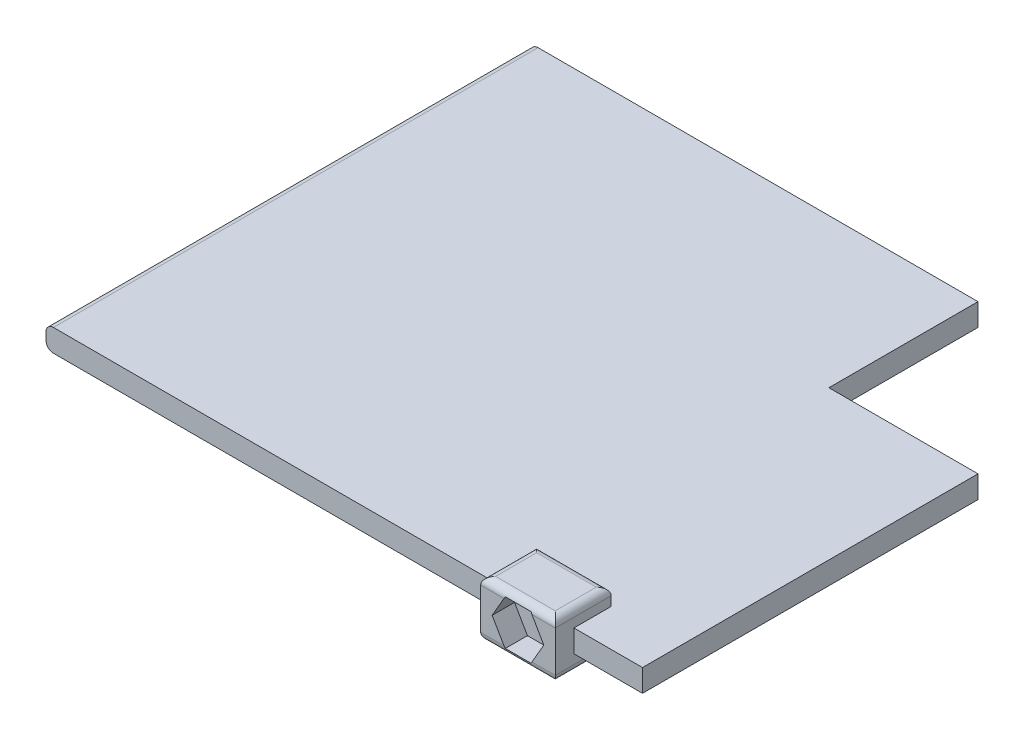
ISO-10303-21;
HEADER;
FILE_DESCRIPTION(('STEP AP214'),'2;1');
FILE_NAME('part.step','',(''),(''),'','','');
FILE_SCHEMA(('AUTOMOTIVE_DESIGN { 1 0 10303 214 1 1 1 1 }'));
ENDSEC;
DATA;
#1=APPLICATION_CONTEXT('core data for automotive mechanical design processes');
#2=APPLICATION_PROTOCOL_DEFINITION('international standard','automotive_design',2000,#1);
#3=PRODUCT_CONTEXT('',#1,'mechanical');
#4=PRODUCT('Part','Part','',(#3));
#5=PRODUCT_RELATED_PRODUCT_CATEGORY('part','',(#4));
#6=PRODUCT_DEFINITION_FORMATION('','',#4);
#7=PRODUCT_DEFINITION_CONTEXT('part definition',#1,'design');
#8=PRODUCT_DEFINITION('design','',#6,#7);
#9=PRODUCT_DEFINITION_SHAPE('','',#8);
#10=(LENGTH_UNIT() NAMED_UNIT(*) SI_UNIT(.MILLI.,.METRE.));
#11=(NAMED_UNIT(*) PLANE_ANGLE_UNIT() SI_UNIT($,.RADIAN.));
#12=(NAMED_UNIT(*) SI_UNIT($,.STERADIAN.) SOLID_ANGLE_UNIT());
#13=UNCERTAINTY_MEASURE_WITH_UNIT(LENGTH_MEASURE(1.E-05),#10,'distance_accuracy_value','');
#14=(GEOMETRIC_REPRESENTATION_CONTEXT(3) GLOBAL_UNCERTAINTY_ASSIGNED_CONTEXT((#13)) GLOBAL_UNIT_ASSIGNED_CONTEXT((#10,
#11,#12)) REPRESENTATION_CONTEXT('',''));
#15=CARTESIAN_POINT('',(0.,0.,0.));
#16=DIRECTION('',(0.,0.,1.));
#17=DIRECTION('',(1.,0.,0.));
#18=AXIS2_PLACEMENT_3D('',#15,#16,#17);
#19=CARTESIAN_POINT('',(0.,0.,70.));
#20=DIRECTION('',(0.,0.,-1.));
#21=DIRECTION('',(-1.,0.,0.));
#22=AXIS2_PLACEMENT_3D('',#19,#20,#21);
#23=PLANE('',#22);
#24=DIRECTION('',(0.,1.,0.));
#25=VECTOR('',#24,1.);
#26=CARTESIAN_POINT('',(61.6060586824194,-4.52178410155881,70.));
#27=LINE('',#26,#25);
#28=CARTESIAN_POINT('',(61.6060586824194,-2.52178410155881,70.));
#29=VERTEX_POINT('',#28);
#30=CARTESIAN_POINT('',(61.6060586824194,8.47821589844119,70.));
#31=VERTEX_POINT('',#30);
#32=EDGE_CURVE('E297',#29,#31,#27,.T.);
#33=ORIENTED_EDGE('',*,*,#32,.T.);
#34=DIRECTION('',(-1.,0.,0.));
#35=VECTOR('',#34,1.);
#36=CARTESIAN_POINT('',(0.,8.47821589844119,70.));
#37=LINE('',#36,#35);
#38=CARTESIAN_POINT('',(55.3573739641616,8.47821589844119,70.));
#39=VERTEX_POINT('',#38);
#40=EDGE_CURVE('E427',#31,#39,#37,.T.);
#41=ORIENTED_EDGE('',*,*,#40,.T.);
#42=DIRECTION('',(-0.500379729351067,0.865806055912381,0.));
#43=VECTOR('',#42,1.);
#44=CARTESIAN_POINT('',(58.5342612465209,2.98125411786546,70.));
#45=LINE('',#44,#43);
#46=CARTESIAN_POINT('',(58.5342612465209,2.98125411786546,70.));
#47=VERTEX_POINT('',#46);
#48=EDGE_CURVE('E275',#47,#39,#45,.T.);
#49=ORIENTED_EDGE('',*,*,#48,.F.);
#50=DIRECTION('',(0.499620174494999,0.866244585112996,0.));
#51=VECTOR('',#50,1.);
#52=CARTESIAN_POINT('',(55.0727911396738,-3.02026441492307,70.));
#53=LINE('',#52,#51);
#54=CARTESIAN_POINT('',(55.3602974922969,-2.52178410155881,70.));
#55=VERTEX_POINT('',#54);
#56=EDGE_CURVE('E273',#55,#47,#53,.T.);
#57=ORIENTED_EDGE('',*,*,#56,.F.);
#58=DIRECTION('',(1.,0.,0.));
#59=VECTOR('',#58,1.);
#60=CARTESIAN_POINT('',(0.,-2.52178410155881,70.));
#61=LINE('',#60,#59);
#62=EDGE_CURVE('E387',#55,#29,#61,.T.);
#63=ORIENTED_EDGE('',*,*,#62,.T.);
#64=EDGE_LOOP('',(#33,#41,#49,#57,#63));
#65=FACE_BOUND('',#64,.T.);
#66=ADVANCED_FACE('F44',(#65),#23,.F.);
#67=CARTESIAN_POINT('',(-80.,6.,65.));
#68=DIRECTION('',(0.,0.,-1.));
#69=DIRECTION('',(-1.,0.,0.));
#70=AXIS2_PLACEMENT_3D('',#67,#68,#69);
#71=PLANE('',#70);
#72=DIRECTION('',(0.,1.,0.));
#73=VECTOR('',#72,1.);
#74=CARTESIAN_POINT('',(61.6060586824194,6.,65.));
#75=LINE('',#74,#73);
#76=CARTESIAN_POINT('',(61.6060586824194,0.,65.));
#77=VERTEX_POINT('',#76);
#78=CARTESIAN_POINT('',(61.6060586824194,6.,65.));
#79=VERTEX_POINT('',#78);
#80=EDGE_CURVE('E313',#77,#79,#75,.T.);
#81=ORIENTED_EDGE('',*,*,#80,.F.);
#82=DIRECTION('',(1.,0.,0.));
#83=VECTOR('',#82,1.);
#84=CARTESIAN_POINT('',(-80.,0.,65.));
#85=LINE('',#84,#83);
#86=CARTESIAN_POINT('',(80.,0.,65.));
#87=VERTEX_POINT('',#86);
#88=EDGE_CURVE('E348',#77,#87,#85,.T.);
#89=ORIENTED_EDGE('',*,*,#88,.T.);
#90=DIRECTION('',(0.,-1.,0.));
#91=VECTOR('',#90,1.);
#92=CARTESIAN_POINT('',(80.,6.,65.));
#93=LINE('',#92,#91);
#94=CARTESIAN_POINT('',(80.,6.,65.));
#95=VERTEX_POINT('',#94);
#96=EDGE_CURVE('E342',#95,#87,#93,.T.);
#97=ORIENTED_EDGE('',*,*,#96,.F.);
#98=DIRECTION('',(1.,0.,0.));
#99=VECTOR('',#98,1.);
#100=CARTESIAN_POINT('',(-80.,6.,65.));
#101=LINE('',#100,#99);
#102=EDGE_CURVE('E339',#79,#95,#101,.T.);
#103=ORIENTED_EDGE('',*,*,#102,.F.);
#104=EDGE_LOOP('',(#81,#89,#97,#103));
#105=FACE_BOUND('',#104,.T.);
#106=ADVANCED_FACE('F482',(#105),#71,.F.);
#107=CARTESIAN_POINT('',(-78.,6.,65.));
#108=VERTEX_POINT('',#107);
#109=CARTESIAN_POINT('',(41.6060586824194,6.,65.));
#110=VERTEX_POINT('',#109);
#111=EDGE_CURVE('E340',#108,#110,#101,.T.);
#112=ORIENTED_EDGE('',*,*,#111,.F.);
#113=CARTESIAN_POINT('',(-78.,4.,65.));
#114=DIRECTION('',(0.,0.,-1.));
#115=DIRECTION('',(-1.,0.,0.));
#116=AXIS2_PLACEMENT_3D('',#113,#114,#115);
#117=CIRCLE('',#116,2.);
#118=CARTESIAN_POINT('',(-80.,4.,65.));
#119=VERTEX_POINT('',#118);
#120=EDGE_CURVE('E374',#108,#119,#117,.F.);
#121=ORIENTED_EDGE('',*,*,#120,.T.);
#122=DIRECTION('',(0.,-1.,0.));
#123=VECTOR('',#122,1.);
#124=CARTESIAN_POINT('',(-80.,6.,65.));
#125=LINE('',#124,#123);
#126=CARTESIAN_POINT('',(-80.,2.,65.));
#127=VERTEX_POINT('',#126);
#128=EDGE_CURVE('E352',#119,#127,#125,.T.);
#129=ORIENTED_EDGE('',*,*,#128,.T.);
#130=CARTESIAN_POINT('',(-78.,2.,65.));
#131=DIRECTION('',(0.,0.,-1.));
#132=DIRECTION('',(-1.,0.,0.));
#133=AXIS2_PLACEMENT_3D('',#130,#131,#132);
#134=CIRCLE('',#133,2.);
#135=CARTESIAN_POINT('',(-78.,0.,65.));
#136=VERTEX_POINT('',#135);
#137=EDGE_CURVE('E372',#127,#136,#134,.F.);
#138=ORIENTED_EDGE('',*,*,#137,.T.);
#139=CARTESIAN_POINT('',(41.6060586824194,0.,65.));
#140=VERTEX_POINT('',#139);
#141=EDGE_CURVE('E336',#136,#140,#85,.T.);
#142=ORIENTED_EDGE('',*,*,#141,.T.);
#143=DIRECTION('',(0.,-1.,0.));
#144=VECTOR('',#143,1.);
#145=CARTESIAN_POINT('',(41.6060586824194,6.,65.));
#146=LINE('',#145,#144);
#147=EDGE_CURVE('E307',#110,#140,#146,.T.);
#148=ORIENTED_EDGE('',*,*,#147,.F.);
#149=EDGE_LOOP('',(#112,#121,#129,#138,#142,#148));
#150=FACE_BOUND('',#149,.T.);
#151=ADVANCED_FACE('F491',(#150),#71,.F.);
#152=CARTESIAN_POINT('',(0.,6.,0.));
#153=DIRECTION('',(0.,-1.,0.));
#154=DIRECTION('',(0.,0.,-1.));
#155=AXIS2_PLACEMENT_3D('',#152,#153,#154);
#156=PLANE('',#155);
#157=DIRECTION('',(-1.,0.,0.));
#158=VECTOR('',#157,1.);
#159=CARTESIAN_POINT('',(-80.,6.,-65.));
#160=LINE('',#159,#158);
#161=CARTESIAN_POINT('',(40.,6.,-65.));
#162=VERTEX_POINT('',#161);
#163=CARTESIAN_POINT('',(-78.,6.,-65.));
#164=VERTEX_POINT('',#163);
#165=EDGE_CURVE('E335',#162,#164,#160,.T.);
#166=ORIENTED_EDGE('',*,*,#165,.T.);
#167=DIRECTION('',(0.,0.,1.));
#168=VECTOR('',#167,1.);
#169=CARTESIAN_POINT('',(-78.,6.,0.));
#170=LINE('',#169,#168);
#171=EDGE_CURVE('E369',#164,#108,#170,.T.);
#172=ORIENTED_EDGE('',*,*,#171,.T.);
#173=ORIENTED_EDGE('',*,*,#111,.T.);
#174=DIRECTION('',(0.,0.,1.));
#175=VECTOR('',#174,1.);
#176=CARTESIAN_POINT('',(41.6060586824194,6.,0.));
#177=LINE('',#176,#175);
#178=CARTESIAN_POINT('',(41.6060586824194,6.,55.));
#179=VERTEX_POINT('',#178);
#180=EDGE_CURVE('E310',#179,#110,#177,.T.);
#181=ORIENTED_EDGE('',*,*,#180,.F.);
#182=DIRECTION('',(1.,0.,0.));
#183=VECTOR('',#182,1.);
#184=CARTESIAN_POINT('',(0.,6.,55.));
#185=LINE('',#184,#183);
#186=CARTESIAN_POINT('',(61.6060586824194,6.,55.));
#187=VERTEX_POINT('',#186);
#188=EDGE_CURVE('E305',#179,#187,#185,.T.);
#189=ORIENTED_EDGE('',*,*,#188,.T.);
#190=DIRECTION('',(0.,0.,-1.));
#191=VECTOR('',#190,1.);
#192=CARTESIAN_POINT('',(61.6060586824194,6.,0.));
#193=LINE('',#192,#191);
#194=EDGE_CURVE('E316',#79,#187,#193,.T.);
#195=ORIENTED_EDGE('',*,*,#194,.F.);
#196=ORIENTED_EDGE('',*,*,#102,.T.);
#197=DIRECTION('',(0.,0.,-1.));
#198=VECTOR('',#197,1.);
#199=CARTESIAN_POINT('',(80.,6.,65.));
#200=LINE('',#199,#198);
#201=CARTESIAN_POINT('',(80.,6.,-25.));
#202=VERTEX_POINT('',#201);
#203=EDGE_CURVE('E332',#95,#202,#200,.T.);
#204=ORIENTED_EDGE('',*,*,#203,.T.);
#205=DIRECTION('',(1.,0.,0.));
#206=VECTOR('',#205,1.);
#207=CARTESIAN_POINT('',(80.,6.,-25.));
#208=LINE('',#207,#206);
#209=CARTESIAN_POINT('',(40.,6.,-25.));
#210=VERTEX_POINT('',#209);
#211=EDGE_CURVE('E322',#210,#202,#208,.T.);
#212=ORIENTED_EDGE('',*,*,#211,.F.);
#213=DIRECTION('',(0.,0.,1.));
#214=VECTOR('',#213,1.);
#215=CARTESIAN_POINT('',(40.,6.,-65.));
#216=LINE('',#215,#214);
#217=EDGE_CURVE('E319',#162,#210,#216,.T.);
#218=ORIENTED_EDGE('',*,*,#217,.F.);
#219=EDGE_LOOP('',(#166,#172,#173,#181,#189,#195,#196,#204,#212,#218));
#220=FACE_BOUND('',#219,.T.);
#221=ADVANCED_FACE('F562',(#220),#156,.F.);
#222=CARTESIAN_POINT('',(0.,0.,0.));
#223=DIRECTION('',(0.,-1.,0.));
#224=DIRECTION('',(0.,0.,-1.));
#225=AXIS2_PLACEMENT_3D('',#222,#223,#224);
#226=PLANE('',#225);
#227=ORIENTED_EDGE('',*,*,#141,.F.);
#228=DIRECTION('',(0.,0.,1.));
#229=VECTOR('',#228,1.);
#230=CARTESIAN_POINT('',(-78.,0.,-65.));
#231=LINE('',#230,#229);
#232=CARTESIAN_POINT('',(-78.,0.,-65.));
#233=VERTEX_POINT('',#232);
#234=EDGE_CURVE('E385',#136,#233,#231,.F.);
#235=ORIENTED_EDGE('',*,*,#234,.T.);
#236=DIRECTION('',(-1.,0.,0.));
#237=VECTOR('',#236,1.);
#238=CARTESIAN_POINT('',(-80.,0.,-65.));
#239=LINE('',#238,#237);
#240=CARTESIAN_POINT('',(40.,0.,-65.));
#241=VERTEX_POINT('',#240);
#242=EDGE_CURVE('E345',#241,#233,#239,.T.);
#243=ORIENTED_EDGE('',*,*,#242,.F.);
#244=DIRECTION('',(0.,0.,-1.));
#245=VECTOR('',#244,1.);
#246=CARTESIAN_POINT('',(40.,0.,0.));
#247=LINE('',#246,#245);
#248=CARTESIAN_POINT('',(40.,0.,-25.));
#249=VERTEX_POINT('',#248);
#250=EDGE_CURVE('E358',#249,#241,#247,.T.);
#251=ORIENTED_EDGE('',*,*,#250,.F.);
#252=DIRECTION('',(-1.,0.,0.));
#253=VECTOR('',#252,1.);
#254=CARTESIAN_POINT('',(0.,0.,-25.));
#255=LINE('',#254,#253);
#256=CARTESIAN_POINT('',(80.,0.,-25.));
#257=VERTEX_POINT('',#256);
#258=EDGE_CURVE('E360',#257,#249,#255,.T.);
#259=ORIENTED_EDGE('',*,*,#258,.F.);
#260=DIRECTION('',(0.,0.,-1.));
#261=VECTOR('',#260,1.);
#262=CARTESIAN_POINT('',(80.,0.,65.));
#263=LINE('',#262,#261);
#264=EDGE_CURVE('E328',#87,#257,#263,.T.);
#265=ORIENTED_EDGE('',*,*,#264,.F.);
#266=ORIENTED_EDGE('',*,*,#88,.F.);
#267=DIRECTION('',(0.,0.,-1.));
#268=VECTOR('',#267,1.);
#269=CARTESIAN_POINT('',(61.6060586824194,0.,0.));
#270=LINE('',#269,#268);
#271=CARTESIAN_POINT('',(61.6060586824194,0.,55.));
#272=VERTEX_POINT('',#271);
#273=EDGE_CURVE('E366',#77,#272,#270,.T.);
#274=ORIENTED_EDGE('',*,*,#273,.T.);
#275=DIRECTION('',(1.,0.,0.));
#276=VECTOR('',#275,1.);
#277=CARTESIAN_POINT('',(0.,0.,55.));
#278=LINE('',#277,#276);
#279=CARTESIAN_POINT('',(41.6060586824194,0.,55.));
#280=VERTEX_POINT('',#279);
#281=EDGE_CURVE('E302',#280,#272,#278,.T.);
#282=ORIENTED_EDGE('',*,*,#281,.F.);
#283=DIRECTION('',(0.,0.,1.));
#284=VECTOR('',#283,1.);
#285=CARTESIAN_POINT('',(41.6060586824194,0.,0.));
#286=LINE('',#285,#284);
#287=EDGE_CURVE('E363',#280,#140,#286,.T.);
#288=ORIENTED_EDGE('',*,*,#287,.T.);
#289=EDGE_LOOP('',(#227,#235,#243,#251,#259,#265,#266,#274,#282,#288));
#290=FACE_BOUND('',#289,.T.);
#291=ADVANCED_FACE('F553',(#290),#226,.T.);
#292=CARTESIAN_POINT('',(80.,6.,65.));
#293=DIRECTION('',(-1.,0.,0.));
#294=DIRECTION('',(0.,0.,1.));
#295=AXIS2_PLACEMENT_3D('',#292,#293,#294);
#296=PLANE('',#295);
#297=ORIENTED_EDGE('',*,*,#264,.T.);
#298=DIRECTION('',(0.,1.,0.));
#299=VECTOR('',#298,1.);
#300=CARTESIAN_POINT('',(80.,-12.,-25.));
#301=LINE('',#300,#299);
#302=EDGE_CURVE('E325',#257,#202,#301,.T.);
#303=ORIENTED_EDGE('',*,*,#302,.T.);
#304=ORIENTED_EDGE('',*,*,#203,.F.);
#305=ORIENTED_EDGE('',*,*,#96,.T.);
#306=EDGE_LOOP('',(#297,#303,#304,#305));
#307=FACE_BOUND('',#306,.T.);
#308=ADVANCED_FACE('F782',(#307),#296,.F.);
#309=CARTESIAN_POINT('',(-80.,6.,-65.));
#310=DIRECTION('',(0.,0.,1.));
#311=DIRECTION('',(1.,0.,0.));
#312=AXIS2_PLACEMENT_3D('',#309,#310,#311);
#313=PLANE('',#312);
#314=DIRECTION('',(0.,-1.,0.));
#315=VECTOR('',#314,1.);
#316=CARTESIAN_POINT('',(-80.,6.,-65.));
#317=LINE('',#316,#315);
#318=CARTESIAN_POINT('',(-80.,4.,-65.));
#319=VERTEX_POINT('',#318);
#320=CARTESIAN_POINT('',(-80.,2.,-65.));
#321=VERTEX_POINT('',#320);
#322=EDGE_CURVE('E355',#319,#321,#317,.T.);
#323=ORIENTED_EDGE('',*,*,#322,.F.);
#324=CARTESIAN_POINT('',(-78.,4.,-65.));
#325=DIRECTION('',(0.,0.,1.));
#326=DIRECTION('',(1.,0.,0.));
#327=AXIS2_PLACEMENT_3D('',#324,#325,#326);
#328=CIRCLE('',#327,2.);
#329=EDGE_CURVE('E383',#319,#164,#328,.F.);
#330=ORIENTED_EDGE('',*,*,#329,.T.);
#331=ORIENTED_EDGE('',*,*,#165,.F.);
#332=DIRECTION('',(0.,1.,0.));
#333=VECTOR('',#332,1.);
#334=CARTESIAN_POINT('',(40.,-12.,-65.));
#335=LINE('',#334,#333);
#336=EDGE_CURVE('E324',#241,#162,#335,.T.);
#337=ORIENTED_EDGE('',*,*,#336,.F.);
#338=ORIENTED_EDGE('',*,*,#242,.T.);
#339=CARTESIAN_POINT('',(-78.,2.,-65.));
#340=DIRECTION('',(0.,0.,1.));
#341=DIRECTION('',(1.,0.,0.));
#342=AXIS2_PLACEMENT_3D('',#339,#340,#341);
#343=CIRCLE('',#342,2.);
#344=EDGE_CURVE('E381',#233,#321,#343,.F.);
#345=ORIENTED_EDGE('',*,*,#344,.T.);
#346=EDGE_LOOP('',(#323,#330,#331,#337,#338,#345));
#347=FACE_BOUND('',#346,.T.);
#348=ADVANCED_FACE('F616',(#347),#313,.F.);
#349=CARTESIAN_POINT('',(-80.,6.,65.));
#350=DIRECTION('',(1.,0.,0.));
#351=DIRECTION('',(0.,0.,-1.));
#352=AXIS2_PLACEMENT_3D('',#349,#350,#351);
#353=PLANE('',#352);
#354=ORIENTED_EDGE('',*,*,#128,.F.);
#355=DIRECTION('',(0.,0.,1.));
#356=VECTOR('',#355,1.);
#357=CARTESIAN_POINT('',(-80.,4.,65.));
#358=LINE('',#357,#356);
#359=EDGE_CURVE('E379',#119,#319,#358,.F.);
#360=ORIENTED_EDGE('',*,*,#359,.T.);
#361=ORIENTED_EDGE('',*,*,#322,.T.);
#362=DIRECTION('',(0.,0.,1.));
#363=VECTOR('',#362,1.);
#364=CARTESIAN_POINT('',(-80.,2.,65.));
#365=LINE('',#364,#363);
#366=EDGE_CURVE('E376',#321,#127,#365,.T.);
#367=ORIENTED_EDGE('',*,*,#366,.T.);
#368=EDGE_LOOP('',(#354,#360,#361,#367));
#369=FACE_BOUND('',#368,.T.);
#370=ADVANCED_FACE('F605',(#369),#353,.F.);
#371=CARTESIAN_POINT('',(80.,-12.,-25.));
#372=DIRECTION('',(0.,0.,1.));
#373=DIRECTION('',(1.,0.,0.));
#374=AXIS2_PLACEMENT_3D('',#371,#372,#373);
#375=PLANE('',#374);
#376=CARTESIAN_POINT('',(51.6060586824194,2.97821589844119,-25.));
#377=DIRECTION('',(0.,0.,1.));
#378=DIRECTION('',(1.,0.,0.));
#379=AXIS2_PLACEMENT_3D('',#376,#377,#378);
#380=CIRCLE('',#379,2.);
#381=CARTESIAN_POINT('',(53.6060586824194,2.97821589844119,-25.));
#382=VERTEX_POINT('',#381);
#383=EDGE_CURVE('E263',#382,#382,#380,.T.);
#384=ORIENTED_EDGE('',*,*,#383,.T.);
#385=EDGE_LOOP('',(#384));
#386=FACE_BOUND('',#385,.T.);
#387=ORIENTED_EDGE('',*,*,#258,.T.);
#388=DIRECTION('',(0.,1.,0.));
#389=VECTOR('',#388,1.);
#390=CARTESIAN_POINT('',(40.,-12.,-25.));
#391=LINE('',#390,#389);
#392=EDGE_CURVE('E329',#249,#210,#391,.T.);
#393=ORIENTED_EDGE('',*,*,#392,.T.);
#394=ORIENTED_EDGE('',*,*,#211,.T.);
#395=ORIENTED_EDGE('',*,*,#302,.F.);
#396=EDGE_LOOP('',(#387,#393,#394,#395));
#397=FACE_BOUND('',#396,.T.);
#398=ADVANCED_FACE('F601',(#386,#397),#375,.F.);
#399=CARTESIAN_POINT('',(40.,-12.,-65.));
#400=DIRECTION('',(-1.,0.,0.));
#401=DIRECTION('',(0.,0.,1.));
#402=AXIS2_PLACEMENT_3D('',#399,#400,#401);
#403=PLANE('',#402);
#404=ORIENTED_EDGE('',*,*,#250,.T.);
#405=ORIENTED_EDGE('',*,*,#336,.T.);
#406=ORIENTED_EDGE('',*,*,#217,.T.);
#407=ORIENTED_EDGE('',*,*,#392,.F.);
#408=EDGE_LOOP('',(#404,#405,#406,#407));
#409=FACE_BOUND('',#408,.T.);
#410=ADVANCED_FACE('F604',(#409),#403,.F.);
#411=CARTESIAN_POINT('',(61.6060586824194,-4.52178410155881,70.));
#412=DIRECTION('',(-1.,0.,0.));
#413=DIRECTION('',(0.,0.,1.));
#414=AXIS2_PLACEMENT_3D('',#411,#412,#413);
#415=PLANE('',#414);
#416=DIRECTION('',(0.,1.,0.));
#417=VECTOR('',#416,1.);
#418=CARTESIAN_POINT('',(61.6060586824194,-4.52178410155881,55.));
#419=LINE('',#418,#417);
#420=CARTESIAN_POINT('',(61.6060586824194,8.47821589844119,55.));
#421=VERTEX_POINT('',#420);
#422=EDGE_CURVE('E281',#187,#421,#419,.T.);
#423=ORIENTED_EDGE('',*,*,#422,.T.);
#424=DIRECTION('',(0.,0.,-1.));
#425=VECTOR('',#424,1.);
#426=CARTESIAN_POINT('',(61.6060586824194,8.47821589844119,70.));
#427=LINE('',#426,#425);
#428=EDGE_CURVE('E11',#421,#31,#427,.F.);
#429=ORIENTED_EDGE('',*,*,#428,.T.);
#430=ORIENTED_EDGE('',*,*,#32,.F.);
#431=DIRECTION('',(0.,0.,-1.));
#432=VECTOR('',#431,1.);
#433=CARTESIAN_POINT('',(61.6060586824194,-2.52178410155881,70.));
#434=LINE('',#433,#432);
#435=CARTESIAN_POINT('',(61.6060586824194,-2.52178410155881,55.));
#436=VERTEX_POINT('',#435);
#437=EDGE_CURVE('E406',#29,#436,#434,.T.);
#438=ORIENTED_EDGE('',*,*,#437,.T.);
#439=EDGE_CURVE('E292',#436,#272,#419,.T.);
#440=ORIENTED_EDGE('',*,*,#439,.T.);
#441=ORIENTED_EDGE('',*,*,#273,.F.);
#442=ORIENTED_EDGE('',*,*,#80,.T.);
#443=ORIENTED_EDGE('',*,*,#194,.T.);
#444=EDGE_LOOP('',(#423,#429,#430,#438,#440,#441,#442,#443));
#445=FACE_BOUND('',#444,.T.);
#446=ADVANCED_FACE('F527',(#445),#415,.F.);
#447=CARTESIAN_POINT('',(41.6060586824194,-4.52178410155881,70.));
#448=DIRECTION('',(1.,0.,0.));
#449=DIRECTION('',(0.,0.,-1.));
#450=AXIS2_PLACEMENT_3D('',#447,#448,#449);
#451=PLANE('',#450);
#452=DIRECTION('',(0.,-1.,0.));
#453=VECTOR('',#452,1.);
#454=CARTESIAN_POINT('',(41.6060586824194,-4.52178410155881,70.));
#455=LINE('',#454,#453);
#456=CARTESIAN_POINT('',(41.6060586824194,8.47821589844119,70.));
#457=VERTEX_POINT('',#456);
#458=CARTESIAN_POINT('',(41.6060586824194,-2.52178410155881,70.));
#459=VERTEX_POINT('',#458);
#460=EDGE_CURVE('E300',#457,#459,#455,.T.);
#461=ORIENTED_EDGE('',*,*,#460,.F.);
#462=DIRECTION('',(0.,0.,-1.));
#463=VECTOR('',#462,1.);
#464=CARTESIAN_POINT('',(41.6060586824194,8.47821589844119,70.));
#465=LINE('',#464,#463);
#466=CARTESIAN_POINT('',(41.6060586824194,8.47821589844119,55.));
#467=VERTEX_POINT('',#466);
#468=EDGE_CURVE('E68',#457,#467,#465,.T.);
#469=ORIENTED_EDGE('',*,*,#468,.T.);
#470=DIRECTION('',(0.,-1.,0.));
#471=VECTOR('',#470,1.);
#472=CARTESIAN_POINT('',(41.6060586824194,-4.52178410155881,55.));
#473=LINE('',#472,#471);
#474=EDGE_CURVE('E295',#467,#179,#473,.T.);
#475=ORIENTED_EDGE('',*,*,#474,.T.);
#476=ORIENTED_EDGE('',*,*,#180,.T.);
#477=ORIENTED_EDGE('',*,*,#147,.T.);
#478=ORIENTED_EDGE('',*,*,#287,.F.);
#479=CARTESIAN_POINT('',(41.6060586824194,-2.52178410155881,55.));
#480=VERTEX_POINT('',#479);
#481=EDGE_CURVE('E294',#280,#480,#473,.T.);
#482=ORIENTED_EDGE('',*,*,#481,.T.);
#483=DIRECTION('',(0.,0.,-1.));
#484=VECTOR('',#483,1.);
#485=CARTESIAN_POINT('',(41.6060586824194,-2.52178410155881,70.));
#486=LINE('',#485,#484);
#487=EDGE_CURVE('E410',#480,#459,#486,.F.);
#488=ORIENTED_EDGE('',*,*,#487,.T.);
#489=EDGE_LOOP('',(#461,#469,#475,#476,#477,#478,#482,#488));
#490=FACE_BOUND('',#489,.T.);
#491=ADVANCED_FACE('F549',(#490),#451,.F.);
#492=CARTESIAN_POINT('',(0.,0.,55.));
#493=DIRECTION('',(0.,0.,-1.));
#494=DIRECTION('',(-1.,0.,0.));
#495=AXIS2_PLACEMENT_3D('',#492,#493,#494);
#496=PLANE('',#495);
#497=ORIENTED_EDGE('',*,*,#474,.F.);
#498=DIRECTION('',(-1.,0.,0.));
#499=VECTOR('',#498,1.);
#500=CARTESIAN_POINT('',(61.6060586824194,8.47821589844119,55.));
#501=LINE('',#500,#499);
#502=EDGE_CURVE('E53',#467,#421,#501,.F.);
#503=ORIENTED_EDGE('',*,*,#502,.T.);
#504=ORIENTED_EDGE('',*,*,#422,.F.);
#505=ORIENTED_EDGE('',*,*,#188,.F.);
#506=EDGE_LOOP('',(#497,#503,#504,#505));
#507=FACE_BOUND('',#506,.T.);
#508=ADVANCED_FACE('F506',(#507),#496,.T.);
#509=CARTESIAN_POINT('',(41.6060586824194,10.4782158984412,70.));
#510=DIRECTION('',(0.,-1.,0.));
#511=DIRECTION('',(0.,0.,-1.));
#512=AXIS2_PLACEMENT_3D('',#509,#510,#511);
#513=PLANE('',#512);
#514=DIRECTION('',(0.,0.,-1.));
#515=VECTOR('',#514,1.);
#516=CARTESIAN_POINT('',(43.6060586824194,10.4782158984412,70.));
#517=LINE('',#516,#515);
#518=CARTESIAN_POINT('',(43.6060586824194,10.4782158984412,57.));
#519=VERTEX_POINT('',#518);
#520=CARTESIAN_POINT('',(43.6060586824194,10.4782158984412,68.));
#521=VERTEX_POINT('',#520);
#522=EDGE_CURVE('E440',#519,#521,#517,.F.);
#523=ORIENTED_EDGE('',*,*,#522,.T.);
#524=DIRECTION('',(-1.,0.,0.));
#525=VECTOR('',#524,1.);
#526=CARTESIAN_POINT('',(41.6060586824194,10.4782158984412,68.));
#527=LINE('',#526,#525);
#528=CARTESIAN_POINT('',(59.6060586824194,10.4782158984412,68.));
#529=VERTEX_POINT('',#528);
#530=EDGE_CURVE('E442',#521,#529,#527,.F.);
#531=ORIENTED_EDGE('',*,*,#530,.T.);
#532=DIRECTION('',(0.,0.,-1.));
#533=VECTOR('',#532,1.);
#534=CARTESIAN_POINT('',(59.6060586824194,10.4782158984412,70.));
#535=LINE('',#534,#533);
#536=CARTESIAN_POINT('',(59.6060586824194,10.4782158984412,57.));
#537=VERTEX_POINT('',#536);
#538=EDGE_CURVE('E436',#529,#537,#535,.T.);
#539=ORIENTED_EDGE('',*,*,#538,.T.);
#540=DIRECTION('',(-1.,0.,0.));
#541=VECTOR('',#540,1.);
#542=CARTESIAN_POINT('',(41.6060586824194,10.4782158984412,57.));
#543=LINE('',#542,#541);
#544=EDGE_CURVE('E438',#537,#519,#543,.T.);
#545=ORIENTED_EDGE('',*,*,#544,.T.);
#546=EDGE_LOOP('',(#523,#531,#539,#545));
#547=FACE_BOUND('',#546,.T.);
#548=ADVANCED_FACE('F466',(#547),#513,.F.);
#549=CARTESIAN_POINT('',(41.6060586824194,-4.52178410155881,70.));
#550=DIRECTION('',(0.,1.,0.));
#551=DIRECTION('',(0.,0.,1.));
#552=AXIS2_PLACEMENT_3D('',#549,#550,#551);
#553=PLANE('',#552);
#554=DIRECTION('',(0.,0.,-1.));
#555=VECTOR('',#554,1.);
#556=CARTESIAN_POINT('',(59.6060586824194,-4.52178410155881,70.));
#557=LINE('',#556,#555);
#558=CARTESIAN_POINT('',(59.6060586824194,-4.52178410155881,57.));
#559=VERTEX_POINT('',#558);
#560=CARTESIAN_POINT('',(59.6060586824194,-4.52178410155881,68.));
#561=VERTEX_POINT('',#560);
#562=EDGE_CURVE('E401',#559,#561,#557,.F.);
#563=ORIENTED_EDGE('',*,*,#562,.T.);
#564=DIRECTION('',(1.,0.,0.));
#565=VECTOR('',#564,1.);
#566=CARTESIAN_POINT('',(41.6060586824194,-4.52178410155881,68.));
#567=LINE('',#566,#565);
#568=CARTESIAN_POINT('',(43.6060586824194,-4.52178410155881,68.));
#569=VERTEX_POINT('',#568);
#570=EDGE_CURVE('E403',#561,#569,#567,.F.);
#571=ORIENTED_EDGE('',*,*,#570,.T.);
#572=DIRECTION('',(0.,0.,-1.));
#573=VECTOR('',#572,1.);
#574=CARTESIAN_POINT('',(43.6060586824194,-4.52178410155881,70.));
#575=LINE('',#574,#573);
#576=CARTESIAN_POINT('',(43.6060586824194,-4.52178410155881,57.));
#577=VERTEX_POINT('',#576);
#578=EDGE_CURVE('E397',#569,#577,#575,.T.);
#579=ORIENTED_EDGE('',*,*,#578,.T.);
#580=DIRECTION('',(1.,0.,0.));
#581=VECTOR('',#580,1.);
#582=CARTESIAN_POINT('',(61.6060586824194,-4.52178410155881,57.));
#583=LINE('',#582,#581);
#584=EDGE_CURVE('E399',#577,#559,#583,.T.);
#585=ORIENTED_EDGE('',*,*,#584,.T.);
#586=EDGE_LOOP('',(#563,#571,#579,#585));
#587=FACE_BOUND('',#586,.T.);
#588=ADVANCED_FACE('F498',(#587),#553,.F.);
#589=DIRECTION('',(-0.499620174494998,-0.866244585112997,0.));
#590=VECTOR('',#589,1.);
#591=CARTESIAN_POINT('',(48.1393262251649,8.97669621180544,70.));
#592=LINE('',#591,#590);
#593=CARTESIAN_POINT('',(47.8518198725418,8.47821589844119,70.));
#594=VERTEX_POINT('',#593);
#595=CARTESIAN_POINT('',(44.6778561183178,2.97517767901691,70.));
#596=VERTEX_POINT('',#595);
#597=EDGE_CURVE('E260',#594,#596,#592,.T.);
#598=ORIENTED_EDGE('',*,*,#597,.F.);
#599=DIRECTION('',(-1.,0.,0.));
#600=VECTOR('',#599,1.);
#601=CARTESIAN_POINT('',(0.,8.47821589844119,70.));
#602=LINE('',#601,#600);
#603=EDGE_CURVE('E413',#594,#457,#602,.T.);
#604=ORIENTED_EDGE('',*,*,#603,.T.);
#605=ORIENTED_EDGE('',*,*,#460,.T.);
#606=DIRECTION('',(1.,0.,0.));
#607=VECTOR('',#606,1.);
#608=CARTESIAN_POINT('',(0.,-2.52178410155881,70.));
#609=LINE('',#608,#607);
#610=CARTESIAN_POINT('',(47.8547434006771,-2.52178410155882,70.));
#611=VERTEX_POINT('',#610);
#612=EDGE_CURVE('E389',#459,#611,#609,.T.);
#613=ORIENTED_EDGE('',*,*,#612,.T.);
#614=DIRECTION('',(0.500379729351067,-0.865806055912381,0.));
#615=VECTOR('',#614,1.);
#616=CARTESIAN_POINT('',(44.6778561183178,2.97517767901691,70.));
#617=LINE('',#616,#615);
#618=EDGE_CURVE('E257',#596,#611,#617,.T.);
#619=ORIENTED_EDGE('',*,*,#618,.F.);
#620=EDGE_LOOP('',(#598,#604,#605,#613,#619));
#621=FACE_BOUND('',#620,.T.);
#622=ADVANCED_FACE('F485',(#621),#23,.F.);
#623=ORIENTED_EDGE('',*,*,#439,.F.);
#624=DIRECTION('',(1.,0.,0.));
#625=VECTOR('',#624,1.);
#626=CARTESIAN_POINT('',(41.6060586824194,-2.52178410155881,55.));
#627=LINE('',#626,#625);
#628=EDGE_CURVE('E408',#436,#480,#627,.F.);
#629=ORIENTED_EDGE('',*,*,#628,.T.);
#630=ORIENTED_EDGE('',*,*,#481,.F.);
#631=ORIENTED_EDGE('',*,*,#281,.T.);
#632=EDGE_LOOP('',(#623,#629,#630,#631));
#633=FACE_BOUND('',#632,.T.);
#634=ADVANCED_FACE('F497',(#633),#496,.T.);
#635=CARTESIAN_POINT('',(48.1445885755723,-3.02330263434735,64.));
#636=DIRECTION('',(0.000438529200615658,-0.999999903846066,0.));
#637=DIRECTION('',(0.999999903846066,0.000438529200615658,0.));
#638=AXIS2_PLACEMENT_3D('',#635,#636,#637);
#639=PLANE('',#638);
#640=DIRECTION('',(0.,0.,1.));
#641=VECTOR('',#640,1.);
#642=CARTESIAN_POINT('',(48.1445885755723,-3.02330263434735,64.));
#643=LINE('',#642,#641);
#644=CARTESIAN_POINT('',(48.1445885755723,-3.02330263434735,64.));
#645=VERTEX_POINT('',#644);
#646=CARTESIAN_POINT('',(48.1445885755723,-3.02330263434735,69.9360989544106));
#647=VERTEX_POINT('',#646);
#648=EDGE_CURVE('E279',#645,#647,#643,.T.);
#649=ORIENTED_EDGE('',*,*,#648,.T.);
#650=CARTESIAN_POINT('',(1191.78219323557,-2.52178410155881,68.));
#651=DIRECTION('',(0.000438529200615658,-0.999999903846066,0.));
#652=DIRECTION('',(0.999999903846066,0.000438529200615658,0.));
#653=AXIS2_PLACEMENT_3D('',#650,#651,#652);
#654=ELLIPSE('',#653,4560.69971439113,2.);
#655=CARTESIAN_POINT('',(55.0727911396738,-3.02026441492307,69.9368834185847));
#656=VERTEX_POINT('',#655);
#657=EDGE_CURVE('E239',#647,#656,#654,.F.);
#658=ORIENTED_EDGE('',*,*,#657,.T.);
#659=DIRECTION('',(0.,0.,1.));
#660=VECTOR('',#659,1.);
#661=CARTESIAN_POINT('',(55.0727911396738,-3.02026441492307,64.));
#662=LINE('',#661,#660);
#663=CARTESIAN_POINT('',(55.0727911396738,-3.02026441492307,64.));
#664=VERTEX_POINT('',#663);
#665=EDGE_CURVE('E231',#664,#656,#662,.T.);
#666=ORIENTED_EDGE('',*,*,#665,.F.);
#667=DIRECTION('',(0.999999903846065,0.000438529200615658,0.));
#668=VECTOR('',#667,1.);
#669=CARTESIAN_POINT('',(48.1445885755723,-3.02330263434735,64.));
#670=LINE('',#669,#668);
#671=EDGE_CURVE('E236',#645,#664,#670,.T.);
#672=ORIENTED_EDGE('',*,*,#671,.F.);
#673=EDGE_LOOP('',(#649,#658,#666,#672));
#674=FACE_BOUND('',#673,.T.);
#675=ADVANCED_FACE('F234',(#674),#639,.F.);
#676=CARTESIAN_POINT('',(44.6778561183178,2.97517767901691,64.));
#677=DIRECTION('',(-0.865806055912381,-0.500379729351067,0.));
#678=DIRECTION('',(0.500379729351067,-0.865806055912381,0.));
#679=AXIS2_PLACEMENT_3D('',#676,#677,#678);
#680=PLANE('',#679);
#681=ORIENTED_EDGE('',*,*,#618,.T.);
#682=CARTESIAN_POINT('',(47.8547434006771,-2.52178410155881,68.));
#683=DIRECTION('',(-0.865806055912381,-0.500379729351067,0.));
#684=DIRECTION('',(0.500379729351067,-0.865806055912381,0.));
#685=AXIS2_PLACEMENT_3D('',#682,#683,#684);
#686=ELLIPSE('',#685,2.30998615260598,2.);
#687=EDGE_CURVE('E392',#611,#647,#686,.F.);
#688=ORIENTED_EDGE('',*,*,#687,.T.);
#689=ORIENTED_EDGE('',*,*,#648,.F.);
#690=DIRECTION('',(0.500379729351067,-0.865806055912381,0.));
#691=VECTOR('',#690,1.);
#692=CARTESIAN_POINT('',(44.6778561183178,2.97517767901691,64.));
#693=LINE('',#692,#691);
#694=CARTESIAN_POINT('',(44.6778561183178,2.97517767901691,64.));
#695=VERTEX_POINT('',#694);
#696=EDGE_CURVE('E243',#695,#645,#693,.T.);
#697=ORIENTED_EDGE('',*,*,#696,.F.);
#698=DIRECTION('',(0.,0.,1.));
#699=VECTOR('',#698,1.);
#700=CARTESIAN_POINT('',(44.6778561183178,2.97517767901691,64.));
#701=LINE('',#700,#699);
#702=EDGE_CURVE('E282',#695,#596,#701,.T.);
#703=ORIENTED_EDGE('',*,*,#702,.T.);
#704=EDGE_LOOP('',(#681,#688,#689,#697,#703));
#705=FACE_BOUND('',#704,.T.);
#706=ADVANCED_FACE('F575',(#705),#680,.F.);
#707=CARTESIAN_POINT('',(48.1393262251649,8.97669621180544,64.));
#708=DIRECTION('',(-0.866244585112997,0.499620174494998,0.));
#709=DIRECTION('',(-0.499620174494998,-0.866244585112997,0.));
#710=AXIS2_PLACEMENT_3D('',#707,#708,#709);
#711=PLANE('',#710);
#712=DIRECTION('',(0.,0.,1.));
#713=VECTOR('',#712,1.);
#714=CARTESIAN_POINT('',(48.1393262251649,8.97669621180544,64.));
#715=LINE('',#714,#713);
#716=CARTESIAN_POINT('',(48.1393262251649,8.97669621180544,64.));
#717=VERTEX_POINT('',#716);
#718=CARTESIAN_POINT('',(48.1393262251649,8.97669621180544,69.9368834185847));
#719=VERTEX_POINT('',#718);
#720=EDGE_CURVE('E285',#717,#719,#715,.T.);
#721=ORIENTED_EDGE('',*,*,#720,.T.);
#722=CARTESIAN_POINT('',(47.8518198725418,8.47821589844119,68.));
#723=DIRECTION('',(-0.866244585112997,0.499620174494998,0.));
#724=DIRECTION('',(-0.499620174494998,-0.866244585112997,0.));
#725=AXIS2_PLACEMENT_3D('',#722,#723,#724);
#726=ELLIPSE('',#725,2.30881674110449,2.);
#727=EDGE_CURVE('E434',#719,#594,#726,.F.);
#728=ORIENTED_EDGE('',*,*,#727,.T.);
#729=ORIENTED_EDGE('',*,*,#597,.T.);
#730=ORIENTED_EDGE('',*,*,#702,.F.);
#731=DIRECTION('',(-0.499620174494998,-0.866244585112997,0.));
#732=VECTOR('',#731,1.);
#733=CARTESIAN_POINT('',(48.1393262251649,8.97669621180544,64.));
#734=LINE('',#733,#732);
#735=EDGE_CURVE('E270',#717,#695,#734,.T.);
#736=ORIENTED_EDGE('',*,*,#735,.F.);
#737=EDGE_LOOP('',(#721,#728,#729,#730,#736));
#738=FACE_BOUND('',#737,.T.);
#739=ADVANCED_FACE('F514',(#738),#711,.F.);
#740=CARTESIAN_POINT('',(55.0675287892664,8.97973443122972,64.));
#741=DIRECTION('',(-0.00043852920061572,0.999999903846066,0.));
#742=DIRECTION('',(-0.999999903846066,-0.00043852920061572,0.));
#743=AXIS2_PLACEMENT_3D('',#740,#741,#742);
#744=PLANE('',#743);
#745=DIRECTION('',(0.,0.,1.));
#746=VECTOR('',#745,1.);
#747=CARTESIAN_POINT('',(55.0675287892664,8.97973443122972,64.));
#748=LINE('',#747,#746);
#749=CARTESIAN_POINT('',(55.0675287892664,8.97973443122972,64.));
#750=VERTEX_POINT('',#749);
#751=CARTESIAN_POINT('',(55.0675287892664,8.97973443122972,69.9360989544106));
#752=VERTEX_POINT('',#751);
#753=EDGE_CURVE('E288',#750,#752,#748,.T.);
#754=ORIENTED_EDGE('',*,*,#753,.T.);
#755=CARTESIAN_POINT('',(-1088.57007587057,8.47821589844119,68.));
#756=DIRECTION('',(-0.00043852920061572,0.999999903846066,0.));
#757=DIRECTION('',(-0.999999903846066,-0.00043852920061572,0.));
#758=AXIS2_PLACEMENT_3D('',#755,#756,#757);
#759=ELLIPSE('',#758,4560.69971439048,2.);
#760=EDGE_CURVE('E432',#752,#719,#759,.F.);
#761=ORIENTED_EDGE('',*,*,#760,.T.);
#762=ORIENTED_EDGE('',*,*,#720,.F.);
#763=DIRECTION('',(-0.999999903846065,-0.00043852920061572,0.));
#764=VECTOR('',#763,1.);
#765=CARTESIAN_POINT('',(55.0675287892664,8.97973443122972,64.));
#766=LINE('',#765,#764);
#767=EDGE_CURVE('E267',#750,#717,#766,.T.);
#768=ORIENTED_EDGE('',*,*,#767,.F.);
#769=EDGE_LOOP('',(#754,#761,#762,#768));
#770=FACE_BOUND('',#769,.T.);
#771=ADVANCED_FACE('F518',(#770),#744,.F.);
#772=CARTESIAN_POINT('',(58.5342612465209,2.98125411786546,64.));
#773=DIRECTION('',(0.865806055912381,0.500379729351067,0.));
#774=DIRECTION('',(-0.500379729351067,0.865806055912381,0.));
#775=AXIS2_PLACEMENT_3D('',#772,#773,#774);
#776=PLANE('',#775);
#777=ORIENTED_EDGE('',*,*,#48,.T.);
#778=CARTESIAN_POINT('',(55.3573739641616,8.47821589844119,68.));
#779=DIRECTION('',(0.865806055912381,0.500379729351067,0.));
#780=DIRECTION('',(-0.500379729351067,0.865806055912381,0.));
#781=AXIS2_PLACEMENT_3D('',#778,#779,#780);
#782=ELLIPSE('',#781,2.30998615260598,2.);
#783=EDGE_CURVE('E430',#39,#752,#782,.F.);
#784=ORIENTED_EDGE('',*,*,#783,.T.);
#785=ORIENTED_EDGE('',*,*,#753,.F.);
#786=DIRECTION('',(-0.500379729351067,0.865806055912381,0.));
#787=VECTOR('',#786,1.);
#788=CARTESIAN_POINT('',(58.5342612465209,2.98125411786546,64.));
#789=LINE('',#788,#787);
#790=CARTESIAN_POINT('',(58.5342612465209,2.98125411786546,64.));
#791=VERTEX_POINT('',#790);
#792=EDGE_CURVE('E252',#791,#750,#789,.T.);
#793=ORIENTED_EDGE('',*,*,#792,.F.);
#794=DIRECTION('',(0.,0.,1.));
#795=VECTOR('',#794,1.);
#796=CARTESIAN_POINT('',(58.5342612465209,2.98125411786546,64.));
#797=LINE('',#796,#795);
#798=EDGE_CURVE('E242',#791,#47,#797,.T.);
#799=ORIENTED_EDGE('',*,*,#798,.T.);
#800=EDGE_LOOP('',(#777,#784,#785,#793,#799));
#801=FACE_BOUND('',#800,.T.);
#802=ADVANCED_FACE('F520',(#801),#776,.F.);
#803=CARTESIAN_POINT('',(55.0727911396738,-3.02026441492307,64.));
#804=DIRECTION('',(0.866244585112996,-0.499620174494999,0.));
#805=DIRECTION('',(0.499620174494999,0.866244585112996,0.));
#806=AXIS2_PLACEMENT_3D('',#803,#804,#805);
#807=PLANE('',#806);
#808=ORIENTED_EDGE('',*,*,#665,.T.);
#809=CARTESIAN_POINT('',(55.3602974922969,-2.52178410155881,68.));
#810=DIRECTION('',(0.866244585112996,-0.499620174494999,0.));
#811=DIRECTION('',(0.499620174494999,0.866244585112996,0.));
#812=AXIS2_PLACEMENT_3D('',#809,#810,#811);
#813=ELLIPSE('',#812,2.30881674110449,2.);
#814=EDGE_CURVE('E395',#656,#55,#813,.F.);
#815=ORIENTED_EDGE('',*,*,#814,.T.);
#816=ORIENTED_EDGE('',*,*,#56,.T.);
#817=ORIENTED_EDGE('',*,*,#798,.F.);
#818=DIRECTION('',(0.499620174494999,0.866244585112996,0.));
#819=VECTOR('',#818,1.);
#820=CARTESIAN_POINT('',(55.0727911396738,-3.02026441492307,64.));
#821=LINE('',#820,#819);
#822=EDGE_CURVE('E246',#664,#791,#821,.T.);
#823=ORIENTED_EDGE('',*,*,#822,.F.);
#824=EDGE_LOOP('',(#808,#815,#816,#817,#823));
#825=FACE_BOUND('',#824,.T.);
#826=ADVANCED_FACE('F247',(#825),#807,.F.);
#827=CARTESIAN_POINT('',(0.,0.,64.));
#828=DIRECTION('',(0.,0.,1.));
#829=DIRECTION('',(1.,0.,0.));
#830=AXIS2_PLACEMENT_3D('',#827,#828,#829);
#831=PLANE('',#830);
#832=CARTESIAN_POINT('',(51.6060586824194,2.97821589844119,64.));
#833=DIRECTION('',(0.,0.,1.));
#834=DIRECTION('',(1.,0.,0.));
#835=AXIS2_PLACEMENT_3D('',#832,#833,#834);
#836=CIRCLE('',#835,2.);
#837=CARTESIAN_POINT('',(53.6060586824194,2.97821589844119,64.));
#838=VERTEX_POINT('',#837);
#839=EDGE_CURVE('E425',#838,#838,#836,.T.);
#840=ORIENTED_EDGE('',*,*,#839,.F.);
#841=EDGE_LOOP('',(#840));
#842=FACE_BOUND('',#841,.T.);
#843=ORIENTED_EDGE('',*,*,#671,.T.);
#844=ORIENTED_EDGE('',*,*,#822,.T.);
#845=ORIENTED_EDGE('',*,*,#792,.T.);
#846=ORIENTED_EDGE('',*,*,#767,.T.);
#847=ORIENTED_EDGE('',*,*,#735,.T.);
#848=ORIENTED_EDGE('',*,*,#696,.T.);
#849=EDGE_LOOP('',(#843,#844,#845,#846,#847,#848));
#850=FACE_BOUND('',#849,.T.);
#851=ADVANCED_FACE('F254',(#842,#850),#831,.T.);
#852=CARTESIAN_POINT('',(51.6060586824194,2.97821589844118,2.));
#853=DIRECTION('',(0.,0.,1.));
#854=DIRECTION('',(1.,0.,0.));
#855=AXIS2_PLACEMENT_3D('',#852,#853,#854);
#856=CYLINDRICAL_SURFACE('',#855,2.);
#857=ORIENTED_EDGE('',*,*,#839,.T.);
#858=EDGE_LOOP('',(#857));
#859=FACE_BOUND('',#858,.T.);
#860=ORIENTED_EDGE('',*,*,#383,.F.);
#861=EDGE_LOOP('',(#860));
#862=FACE_BOUND('',#861,.T.);
#863=ADVANCED_FACE('F587',(#859,#862),#856,.F.);
#864=CARTESIAN_POINT('',(-78.,4.,0.));
#865=DIRECTION('',(0.,0.,1.));
#866=DIRECTION('',(1.,0.,0.));
#867=AXIS2_PLACEMENT_3D('',#864,#865,#866);
#868=CYLINDRICAL_SURFACE('',#867,2.);
#869=ORIENTED_EDGE('',*,*,#329,.F.);
#870=ORIENTED_EDGE('',*,*,#359,.F.);
#871=ORIENTED_EDGE('',*,*,#120,.F.);
#872=ORIENTED_EDGE('',*,*,#171,.F.);
#873=EDGE_LOOP('',(#869,#870,#871,#872));
#874=FACE_BOUND('',#873,.T.);
#875=ADVANCED_FACE('F593',(#874),#868,.T.);
#876=CARTESIAN_POINT('',(-78.,2.,65.));
#877=DIRECTION('',(0.,0.,-1.));
#878=DIRECTION('',(-1.,0.,0.));
#879=AXIS2_PLACEMENT_3D('',#876,#877,#878);
#880=CYLINDRICAL_SURFACE('',#879,2.);
#881=ORIENTED_EDGE('',*,*,#344,.F.);
#882=ORIENTED_EDGE('',*,*,#234,.F.);
#883=ORIENTED_EDGE('',*,*,#137,.F.);
#884=ORIENTED_EDGE('',*,*,#366,.F.);
#885=EDGE_LOOP('',(#881,#882,#883,#884));
#886=FACE_BOUND('',#885,.T.);
#887=ADVANCED_FACE('F628',(#886),#880,.T.);
#888=CARTESIAN_POINT('',(41.6060586824194,-2.52178410155881,57.));
#889=DIRECTION('',(-1.,0.,0.));
#890=DIRECTION('',(0.,0.,1.));
#891=AXIS2_PLACEMENT_3D('',#888,#889,#890);
#892=CYLINDRICAL_SURFACE('',#891,2.);
#893=CARTESIAN_POINT('',(59.6060586824194,-2.52178410155881,57.));
#894=DIRECTION('',(-0.707106781186547,0.,-0.707106781186547));
#895=DIRECTION('',(-0.707106781186547,0.,0.707106781186547));
#896=AXIS2_PLACEMENT_3D('',#893,#894,#895);
#897=ELLIPSE('',#896,2.82842712474619,2.);
#898=EDGE_CURVE('E419',#559,#436,#897,.F.);
#899=ORIENTED_EDGE('',*,*,#898,.F.);
#900=ORIENTED_EDGE('',*,*,#584,.F.);
#901=CARTESIAN_POINT('',(43.6060586824194,-2.52178410155881,57.));
#902=DIRECTION('',(0.707106781186547,0.,-0.707106781186547));
#903=DIRECTION('',(-0.707106781186547,0.,-0.707106781186547));
#904=AXIS2_PLACEMENT_3D('',#901,#902,#903);
#905=ELLIPSE('',#904,2.82842712474619,2.);
#906=EDGE_CURVE('E422',#480,#577,#905,.F.);
#907=ORIENTED_EDGE('',*,*,#906,.F.);
#908=ORIENTED_EDGE('',*,*,#628,.F.);
#909=EDGE_LOOP('',(#899,#900,#907,#908));
#910=FACE_BOUND('',#909,.T.);
#911=ADVANCED_FACE('F544',(#910),#892,.T.);
#912=CARTESIAN_POINT('',(43.6060586824194,-2.52178410155881,70.));
#913=DIRECTION('',(0.,0.,-1.));
#914=DIRECTION('',(-1.,0.,0.));
#915=AXIS2_PLACEMENT_3D('',#912,#913,#914);
#916=CYLINDRICAL_SURFACE('',#915,2.);
#917=ORIENTED_EDGE('',*,*,#906,.T.);
#918=ORIENTED_EDGE('',*,*,#578,.F.);
#919=CARTESIAN_POINT('',(43.6060586824194,-2.52178410155881,68.));
#920=DIRECTION('',(-0.707106781186547,0.,-0.707106781186547));
#921=DIRECTION('',(0.707106781186547,0.,-0.707106781186547));
#922=AXIS2_PLACEMENT_3D('',#919,#920,#921);
#923=ELLIPSE('',#922,2.82842712474619,2.);
#924=EDGE_CURVE('E417',#459,#569,#923,.F.);
#925=ORIENTED_EDGE('',*,*,#924,.F.);
#926=ORIENTED_EDGE('',*,*,#487,.F.);
#927=EDGE_LOOP('',(#917,#918,#925,#926));
#928=FACE_BOUND('',#927,.T.);
#929=ADVANCED_FACE('F635',(#928),#916,.T.);
#930=CARTESIAN_POINT('',(59.6060586824194,-2.52178410155881,70.));
#931=DIRECTION('',(0.,0.,-1.));
#932=DIRECTION('',(-1.,0.,0.));
#933=AXIS2_PLACEMENT_3D('',#930,#931,#932);
#934=CYLINDRICAL_SURFACE('',#933,2.);
#935=ORIENTED_EDGE('',*,*,#898,.T.);
#936=ORIENTED_EDGE('',*,*,#437,.F.);
#937=CARTESIAN_POINT('',(59.6060586824194,-2.52178410155881,68.));
#938=DIRECTION('',(0.707106781186547,0.,-0.707106781186547));
#939=DIRECTION('',(-0.707106781186547,0.,-0.707106781186547));
#940=AXIS2_PLACEMENT_3D('',#937,#938,#939);
#941=ELLIPSE('',#940,2.82842712474619,2.);
#942=EDGE_CURVE('E414',#561,#29,#941,.F.);
#943=ORIENTED_EDGE('',*,*,#942,.F.);
#944=ORIENTED_EDGE('',*,*,#562,.F.);
#945=EDGE_LOOP('',(#935,#936,#943,#944));
#946=FACE_BOUND('',#945,.T.);
#947=ADVANCED_FACE('F531',(#946),#934,.T.);
#948=CARTESIAN_POINT('',(0.,-2.52178410155881,68.));
#949=DIRECTION('',(1.,0.,0.));
#950=DIRECTION('',(0.,0.,-1.));
#951=AXIS2_PLACEMENT_3D('',#948,#949,#950);
#952=CYLINDRICAL_SURFACE('',#951,2.);
#953=ORIENTED_EDGE('',*,*,#924,.T.);
#954=ORIENTED_EDGE('',*,*,#570,.F.);
#955=ORIENTED_EDGE('',*,*,#942,.T.);
#956=ORIENTED_EDGE('',*,*,#62,.F.);
#957=ORIENTED_EDGE('',*,*,#814,.F.);
#958=ORIENTED_EDGE('',*,*,#657,.F.);
#959=ORIENTED_EDGE('',*,*,#687,.F.);
#960=ORIENTED_EDGE('',*,*,#612,.F.);
#961=EDGE_LOOP('',(#953,#954,#955,#956,#957,#958,#959,#960));
#962=FACE_BOUND('',#961,.T.);
#963=ADVANCED_FACE('F536',(#962),#952,.T.);
#964=CARTESIAN_POINT('',(41.6060586824194,8.47821589844119,57.));
#965=DIRECTION('',(1.,0.,0.));
#966=DIRECTION('',(0.,0.,-1.));
#967=AXIS2_PLACEMENT_3D('',#964,#965,#966);
#968=CYLINDRICAL_SURFACE('',#967,2.);
#969=CARTESIAN_POINT('',(43.6060586824194,8.47821589844119,57.));
#970=DIRECTION('',(0.707106781186547,0.,-0.707106781186547));
#971=DIRECTION('',(0.707106781186547,0.,0.707106781186547));
#972=AXIS2_PLACEMENT_3D('',#969,#970,#971);
#973=ELLIPSE('',#972,2.82842712474619,2.);
#974=EDGE_CURVE('E451',#519,#467,#973,.F.);
#975=ORIENTED_EDGE('',*,*,#974,.F.);
#976=ORIENTED_EDGE('',*,*,#544,.F.);
#977=CARTESIAN_POINT('',(59.6060586824194,8.47821589844119,57.));
#978=DIRECTION('',(-0.707106781186547,0.,-0.707106781186547));
#979=DIRECTION('',(0.707106781186547,0.,-0.707106781186547));
#980=AXIS2_PLACEMENT_3D('',#977,#978,#979);
#981=ELLIPSE('',#980,2.82842712474619,2.);
#982=EDGE_CURVE('E48',#421,#537,#981,.F.);
#983=ORIENTED_EDGE('',*,*,#982,.F.);
#984=ORIENTED_EDGE('',*,*,#502,.F.);
#985=EDGE_LOOP('',(#975,#976,#983,#984));
#986=FACE_BOUND('',#985,.T.);
#987=ADVANCED_FACE('F46',(#986),#968,.T.);
#988=CARTESIAN_POINT('',(59.6060586824194,8.47821589844119,70.));
#989=DIRECTION('',(0.,0.,-1.));
#990=DIRECTION('',(-1.,0.,0.));
#991=AXIS2_PLACEMENT_3D('',#988,#989,#990);
#992=CYLINDRICAL_SURFACE('',#991,2.);
#993=ORIENTED_EDGE('',*,*,#982,.T.);
#994=ORIENTED_EDGE('',*,*,#538,.F.);
#995=CARTESIAN_POINT('',(59.6060586824194,8.47821589844119,68.));
#996=DIRECTION('',(0.707106781186547,0.,-0.707106781186547));
#997=DIRECTION('',(-0.707106781186547,0.,-0.707106781186547));
#998=AXIS2_PLACEMENT_3D('',#995,#996,#997);
#999=ELLIPSE('',#998,2.82842712474619,2.);
#1000=EDGE_CURVE('E450',#31,#529,#999,.F.);
#1001=ORIENTED_EDGE('',*,*,#1000,.F.);
#1002=ORIENTED_EDGE('',*,*,#428,.F.);
#1003=EDGE_LOOP('',(#993,#994,#1001,#1002));
#1004=FACE_BOUND('',#1003,.T.);
#1005=ADVANCED_FACE('F461',(#1004),#992,.T.);
#1006=CARTESIAN_POINT('',(43.6060586824194,8.47821589844119,70.));
#1007=DIRECTION('',(0.,0.,-1.));
#1008=DIRECTION('',(-1.,0.,0.));
#1009=AXIS2_PLACEMENT_3D('',#1006,#1007,#1008);
#1010=CYLINDRICAL_SURFACE('',#1009,2.);
#1011=ORIENTED_EDGE('',*,*,#974,.T.);
#1012=ORIENTED_EDGE('',*,*,#468,.F.);
#1013=CARTESIAN_POINT('',(43.6060586824194,8.47821589844119,68.));
#1014=DIRECTION('',(-0.707106781186547,0.,-0.707106781186547));
#1015=DIRECTION('',(0.707106781186547,0.,-0.707106781186547));
#1016=AXIS2_PLACEMENT_3D('',#1013,#1014,#1015);
#1017=ELLIPSE('',#1016,2.82842712474619,2.);
#1018=EDGE_CURVE('E447',#521,#457,#1017,.F.);
#1019=ORIENTED_EDGE('',*,*,#1018,.F.);
#1020=ORIENTED_EDGE('',*,*,#522,.F.);
#1021=EDGE_LOOP('',(#1011,#1012,#1019,#1020));
#1022=FACE_BOUND('',#1021,.T.);
#1023=ADVANCED_FACE('F473',(#1022),#1010,.T.);
#1024=CARTESIAN_POINT('',(0.,8.47821589844119,68.));
#1025=DIRECTION('',(-1.,0.,0.));
#1026=DIRECTION('',(0.,0.,1.));
#1027=AXIS2_PLACEMENT_3D('',#1024,#1025,#1026);
#1028=CYLINDRICAL_SURFACE('',#1027,2.);
#1029=ORIENTED_EDGE('',*,*,#1000,.T.);
#1030=ORIENTED_EDGE('',*,*,#530,.F.);
#1031=ORIENTED_EDGE('',*,*,#1018,.T.);
#1032=ORIENTED_EDGE('',*,*,#603,.F.);
#1033=ORIENTED_EDGE('',*,*,#727,.F.);
#1034=ORIENTED_EDGE('',*,*,#760,.F.);
#1035=ORIENTED_EDGE('',*,*,#783,.F.);
#1036=ORIENTED_EDGE('',*,*,#40,.F.);
#1037=EDGE_LOOP('',(#1029,#1030,#1031,#1032,#1033,#1034,#1035,#1036));
#1038=FACE_BOUND('',#1037,.T.);
#1039=ADVANCED_FACE('F470',(#1038),#1028,.T.);
#1040=CLOSED_SHELL('',(#66,#106,#151,#221,#291,#308,#348,#370,#398,#410,#446,#491,#508,#548,
#588,#622,#634,#675,#706,#739,#771,#802,#826,#851,#863,#875,#887,#911,#929,#947,#963,#987,#1005,
#1023,#1039));
#1041=MANIFOLD_SOLID_BREP('B2',#1040);
#1042=ADVANCED_BREP_SHAPE_REPRESENTATION('',(#18,#1041),#14);
#1043=SHAPE_DEFINITION_REPRESENTATION(#9,#1042);
ENDSEC;
END-ISO-10303-21;
